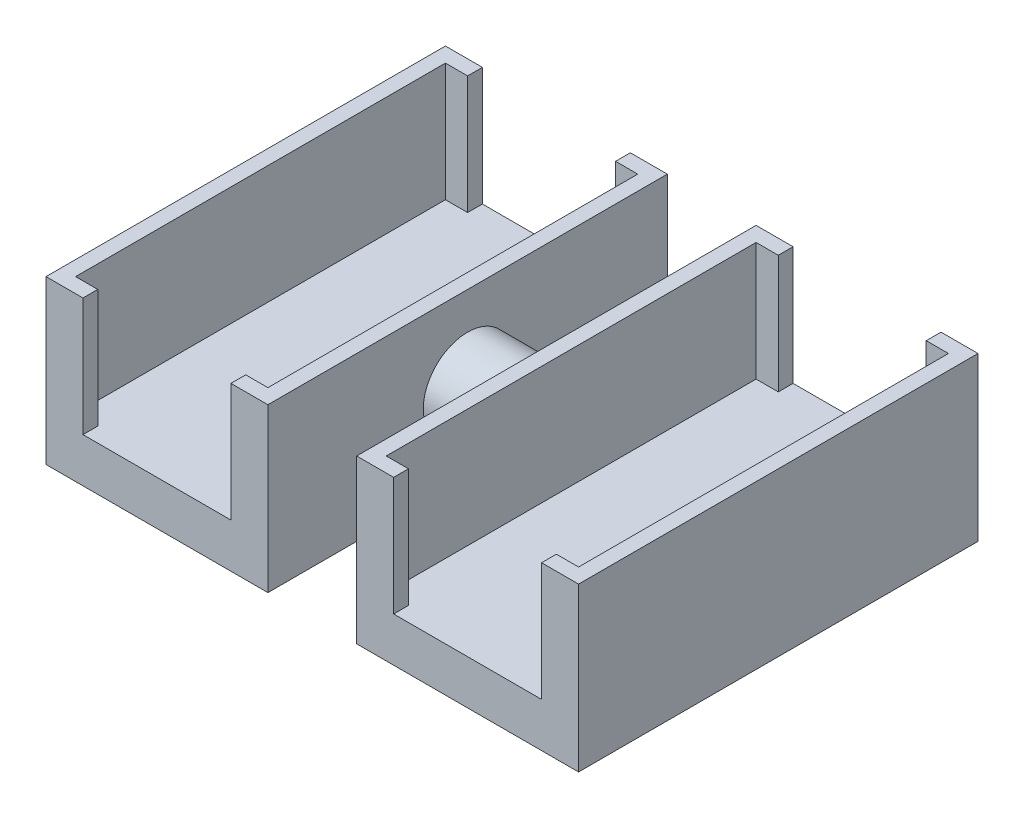
ISO-10303-21;
HEADER;
FILE_DESCRIPTION(('STEP AP214'),'2;1');
FILE_NAME('part.step','',(''),(''),'','','');
FILE_SCHEMA(('AUTOMOTIVE_DESIGN { 1 0 10303 214 1 1 1 1 }'));
ENDSEC;
DATA;
#1=APPLICATION_CONTEXT('core data for automotive mechanical design processes');
#2=APPLICATION_PROTOCOL_DEFINITION('international standard','automotive_design',2000,#1);
#3=PRODUCT_CONTEXT('',#1,'mechanical');
#4=PRODUCT('Part','Part','',(#3));
#5=PRODUCT_RELATED_PRODUCT_CATEGORY('part','',(#4));
#6=PRODUCT_DEFINITION_FORMATION('','',#4);
#7=PRODUCT_DEFINITION_CONTEXT('part definition',#1,'design');
#8=PRODUCT_DEFINITION('design','',#6,#7);
#9=PRODUCT_DEFINITION_SHAPE('','',#8);
#10=(LENGTH_UNIT() NAMED_UNIT(*) SI_UNIT(.MILLI.,.METRE.));
#11=(NAMED_UNIT(*) PLANE_ANGLE_UNIT() SI_UNIT($,.RADIAN.));
#12=(NAMED_UNIT(*) SI_UNIT($,.STERADIAN.) SOLID_ANGLE_UNIT());
#13=UNCERTAINTY_MEASURE_WITH_UNIT(LENGTH_MEASURE(1.E-05),#10,'distance_accuracy_value','');
#14=(GEOMETRIC_REPRESENTATION_CONTEXT(3) GLOBAL_UNCERTAINTY_ASSIGNED_CONTEXT((#13)) GLOBAL_UNIT_ASSIGNED_CONTEXT((#10,
#11,#12)) REPRESENTATION_CONTEXT('',''));
#15=CARTESIAN_POINT('',(0.,0.,0.));
#16=DIRECTION('',(0.,0.,1.));
#17=DIRECTION('',(1.,0.,0.));
#18=AXIS2_PLACEMENT_3D('',#15,#16,#17);
#19=CARTESIAN_POINT('',(0.,3.,0.));
#20=DIRECTION('',(0.,1.,0.));
#21=DIRECTION('',(0.,0.,1.));
#22=AXIS2_PLACEMENT_3D('',#19,#20,#21);
#23=PLANE('',#22);
#24=DIRECTION('',(1.,0.,0.));
#25=VECTOR('',#24,1.);
#26=CARTESIAN_POINT('',(0.,3.,-13.5));
#27=LINE('',#26,#25);
#28=CARTESIAN_POINT('',(-15.5,3.,-13.5));
#29=VERTEX_POINT('',#28);
#30=CARTESIAN_POINT('',(-5.50000000000001,3.,-13.5));
#31=VERTEX_POINT('',#30);
#32=EDGE_CURVE('E493',#29,#31,#27,.T.);
#33=ORIENTED_EDGE('',*,*,#32,.F.);
#34=DIRECTION('',(0.,0.,-1.));
#35=VECTOR('',#34,1.);
#36=CARTESIAN_POINT('',(-15.5,3.,0.));
#37=LINE('',#36,#35);
#38=CARTESIAN_POINT('',(-15.5,3.,-12.5));
#39=VERTEX_POINT('',#38);
#40=EDGE_CURVE('E416',#39,#29,#37,.T.);
#41=ORIENTED_EDGE('',*,*,#40,.F.);
#42=DIRECTION('',(1.,0.,0.));
#43=VECTOR('',#42,1.);
#44=CARTESIAN_POINT('',(0.,3.,-12.5));
#45=LINE('',#44,#43);
#46=CARTESIAN_POINT('',(-17.,3.,-12.5));
#47=VERTEX_POINT('',#46);
#48=EDGE_CURVE('E408',#47,#39,#45,.T.);
#49=ORIENTED_EDGE('',*,*,#48,.F.);
#50=DIRECTION('',(0.,0.,-1.));
#51=VECTOR('',#50,1.);
#52=CARTESIAN_POINT('',(-17.,3.,0.));
#53=LINE('',#52,#51);
#54=CARTESIAN_POINT('',(-17.,3.,12.5));
#55=VERTEX_POINT('',#54);
#56=EDGE_CURVE('E68',#55,#47,#53,.T.);
#57=ORIENTED_EDGE('',*,*,#56,.F.);
#58=DIRECTION('',(-1.,0.,0.));
#59=VECTOR('',#58,1.);
#60=CARTESIAN_POINT('',(0.,3.,12.5));
#61=LINE('',#60,#59);
#62=CARTESIAN_POINT('',(-15.5,3.,12.5));
#63=VERTEX_POINT('',#62);
#64=EDGE_CURVE('E63',#63,#55,#61,.T.);
#65=ORIENTED_EDGE('',*,*,#64,.F.);
#66=DIRECTION('',(0.,0.,-1.));
#67=VECTOR('',#66,1.);
#68=CARTESIAN_POINT('',(-15.5,3.,0.));
#69=LINE('',#68,#67);
#70=CARTESIAN_POINT('',(-15.5,3.,13.5));
#71=VERTEX_POINT('',#70);
#72=EDGE_CURVE('E414',#71,#63,#69,.T.);
#73=ORIENTED_EDGE('',*,*,#72,.F.);
#74=DIRECTION('',(-1.,0.,0.));
#75=VECTOR('',#74,1.);
#76=CARTESIAN_POINT('',(0.,3.,13.5));
#77=LINE('',#76,#75);
#78=CARTESIAN_POINT('',(-5.50000000000001,3.,13.5));
#79=VERTEX_POINT('',#78);
#80=EDGE_CURVE('E490',#79,#71,#77,.T.);
#81=ORIENTED_EDGE('',*,*,#80,.F.);
#82=DIRECTION('',(0.,0.,-1.));
#83=VECTOR('',#82,1.);
#84=CARTESIAN_POINT('',(-5.50000000000001,3.,0.));
#85=LINE('',#84,#83);
#86=CARTESIAN_POINT('',(-5.50000000000001,3.,12.5));
#87=VERTEX_POINT('',#86);
#88=EDGE_CURVE('E465',#79,#87,#85,.T.);
#89=ORIENTED_EDGE('',*,*,#88,.T.);
#90=DIRECTION('',(1.,0.,0.));
#91=VECTOR('',#90,1.);
#92=CARTESIAN_POINT('',(0.,3.,12.5));
#93=LINE('',#92,#91);
#94=CARTESIAN_POINT('',(-4.00000000000001,3.,12.5));
#95=VERTEX_POINT('',#94);
#96=EDGE_CURVE('E468',#87,#95,#93,.T.);
#97=ORIENTED_EDGE('',*,*,#96,.T.);
#98=DIRECTION('',(0.,0.,-1.));
#99=VECTOR('',#98,1.);
#100=CARTESIAN_POINT('',(-4.00000000000001,3.,0.));
#101=LINE('',#100,#99);
#102=CARTESIAN_POINT('',(-4.00000000000001,3.,-12.5));
#103=VERTEX_POINT('',#102);
#104=EDGE_CURVE('E471',#95,#103,#101,.T.);
#105=ORIENTED_EDGE('',*,*,#104,.T.);
#106=DIRECTION('',(-1.,0.,0.));
#107=VECTOR('',#106,1.);
#108=CARTESIAN_POINT('',(0.,3.,-12.5));
#109=LINE('',#108,#107);
#110=CARTESIAN_POINT('',(-5.50000000000001,3.,-12.5));
#111=VERTEX_POINT('',#110);
#112=EDGE_CURVE('E441',#103,#111,#109,.T.);
#113=ORIENTED_EDGE('',*,*,#112,.T.);
#114=DIRECTION('',(0.,0.,-1.));
#115=VECTOR('',#114,1.);
#116=CARTESIAN_POINT('',(-5.50000000000001,3.,0.));
#117=LINE('',#116,#115);
#118=EDGE_CURVE('E419',#111,#31,#117,.T.);
#119=ORIENTED_EDGE('',*,*,#118,.T.);
#120=EDGE_LOOP('',(#33,#41,#49,#57,#65,#73,#81,#89,#97,#105,#113,#119));
#121=FACE_BOUND('',#120,.T.);
#122=ADVANCED_FACE('F46',(#121),#23,.T.);
#123=CARTESIAN_POINT('',(0.,3.,13.5));
#124=DIRECTION('',(0.,0.,1.));
#125=DIRECTION('',(1.,0.,0.));
#126=AXIS2_PLACEMENT_3D('',#123,#124,#125);
#127=PLANE('',#126);
#128=DIRECTION('',(-1.,0.,0.));
#129=VECTOR('',#128,1.);
#130=CARTESIAN_POINT('',(0.,0.,13.5));
#131=LINE('',#130,#129);
#132=CARTESIAN_POINT('',(-3.00000000000001,0.,13.5));
#133=VERTEX_POINT('',#132);
#134=CARTESIAN_POINT('',(-18.,0.,13.5));
#135=VERTEX_POINT('',#134);
#136=EDGE_CURVE('E479',#133,#135,#131,.T.);
#137=ORIENTED_EDGE('',*,*,#136,.F.);
#138=DIRECTION('',(0.,-1.,0.));
#139=VECTOR('',#138,1.);
#140=CARTESIAN_POINT('',(-3.00000000000001,3.,13.5));
#141=LINE('',#140,#139);
#142=CARTESIAN_POINT('',(-3.00000000000001,11.,13.5));
#143=VERTEX_POINT('',#142);
#144=EDGE_CURVE('E50',#143,#133,#141,.T.);
#145=ORIENTED_EDGE('',*,*,#144,.F.);
#146=DIRECTION('',(-1.,0.,0.));
#147=VECTOR('',#146,1.);
#148=CARTESIAN_POINT('',(0.,11.,13.5));
#149=LINE('',#148,#147);
#150=CARTESIAN_POINT('',(-5.50000000000001,11.,13.5));
#151=VERTEX_POINT('',#150);
#152=EDGE_CURVE('E447',#143,#151,#149,.T.);
#153=ORIENTED_EDGE('',*,*,#152,.T.);
#154=DIRECTION('',(0.,-1.,0.));
#155=VECTOR('',#154,1.);
#156=CARTESIAN_POINT('',(-5.50000000000001,11.,13.5));
#157=LINE('',#156,#155);
#158=EDGE_CURVE('E486',#151,#79,#157,.T.);
#159=ORIENTED_EDGE('',*,*,#158,.T.);
#160=ORIENTED_EDGE('',*,*,#80,.T.);
#161=DIRECTION('',(0.,-1.,0.));
#162=VECTOR('',#161,1.);
#163=CARTESIAN_POINT('',(-15.5,11.,13.5));
#164=LINE('',#163,#162);
#165=CARTESIAN_POINT('',(-15.5,11.,13.5));
#166=VERTEX_POINT('',#165);
#167=EDGE_CURVE('E392',#166,#71,#164,.T.);
#168=ORIENTED_EDGE('',*,*,#167,.F.);
#169=DIRECTION('',(1.,0.,0.));
#170=VECTOR('',#169,1.);
#171=CARTESIAN_POINT('',(0.,11.,13.5));
#172=LINE('',#171,#170);
#173=CARTESIAN_POINT('',(-18.,11.,13.5));
#174=VERTEX_POINT('',#173);
#175=EDGE_CURVE('E427',#174,#166,#172,.T.);
#176=ORIENTED_EDGE('',*,*,#175,.F.);
#177=DIRECTION('',(0.,-1.,0.));
#178=VECTOR('',#177,1.);
#179=CARTESIAN_POINT('',(-18.,3.,13.5));
#180=LINE('',#179,#178);
#181=EDGE_CURVE('E496',#174,#135,#180,.T.);
#182=ORIENTED_EDGE('',*,*,#181,.T.);
#183=EDGE_LOOP('',(#137,#145,#153,#159,#160,#168,#176,#182));
#184=FACE_BOUND('',#183,.T.);
#185=ADVANCED_FACE('F48',(#184),#127,.T.);
#186=CARTESIAN_POINT('',(-3.00000000000001,3.,0.));
#187=DIRECTION('',(1.,0.,0.));
#188=DIRECTION('',(0.,0.,-1.));
#189=AXIS2_PLACEMENT_3D('',#186,#187,#188);
#190=PLANE('',#189);
#191=CARTESIAN_POINT('',(-3.00000000000001,5.5,0.));
#192=DIRECTION('',(1.,0.,0.));
#193=DIRECTION('',(0.,0.,-1.));
#194=AXIS2_PLACEMENT_3D('',#191,#192,#193);
#195=CIRCLE('',#194,3.);
#196=CARTESIAN_POINT('',(-3.00000000000001,5.5,-3.));
#197=VERTEX_POINT('',#196);
#198=EDGE_CURVE('E384',#197,#197,#195,.F.);
#199=ORIENTED_EDGE('',*,*,#198,.T.);
#200=EDGE_LOOP('',(#199));
#201=FACE_BOUND('',#200,.T.);
#202=DIRECTION('',(0.,0.,1.));
#203=VECTOR('',#202,1.);
#204=CARTESIAN_POINT('',(-3.00000000000001,0.,0.));
#205=LINE('',#204,#203);
#206=CARTESIAN_POINT('',(-3.00000000000001,0.,-13.5));
#207=VERTEX_POINT('',#206);
#208=EDGE_CURVE('E499',#207,#133,#205,.T.);
#209=ORIENTED_EDGE('',*,*,#208,.F.);
#210=DIRECTION('',(0.,-1.,0.));
#211=VECTOR('',#210,1.);
#212=CARTESIAN_POINT('',(-3.00000000000001,3.,-13.5));
#213=LINE('',#212,#211);
#214=CARTESIAN_POINT('',(-3.00000000000001,11.,-13.5));
#215=VERTEX_POINT('',#214);
#216=EDGE_CURVE('E509',#215,#207,#213,.T.);
#217=ORIENTED_EDGE('',*,*,#216,.F.);
#218=DIRECTION('',(0.,0.,-1.));
#219=VECTOR('',#218,1.);
#220=CARTESIAN_POINT('',(-3.00000000000001,11.,0.));
#221=LINE('',#220,#219);
#222=EDGE_CURVE('E444',#143,#215,#221,.T.);
#223=ORIENTED_EDGE('',*,*,#222,.F.);
#224=ORIENTED_EDGE('',*,*,#144,.T.);
#225=EDGE_LOOP('',(#209,#217,#223,#224));
#226=FACE_BOUND('',#225,.T.);
#227=ADVANCED_FACE('F516',(#201,#226),#190,.T.);
#228=CARTESIAN_POINT('',(0.,3.,-13.5));
#229=DIRECTION('',(0.,0.,-1.));
#230=DIRECTION('',(-1.,0.,0.));
#231=AXIS2_PLACEMENT_3D('',#228,#229,#230);
#232=PLANE('',#231);
#233=DIRECTION('',(1.,0.,0.));
#234=VECTOR('',#233,1.);
#235=CARTESIAN_POINT('',(0.,0.,-13.5));
#236=LINE('',#235,#234);
#237=CARTESIAN_POINT('',(-18.,0.,-13.5));
#238=VERTEX_POINT('',#237);
#239=EDGE_CURVE('E502',#238,#207,#236,.T.);
#240=ORIENTED_EDGE('',*,*,#239,.F.);
#241=DIRECTION('',(0.,-1.,0.));
#242=VECTOR('',#241,1.);
#243=CARTESIAN_POINT('',(-18.,3.,-13.5));
#244=LINE('',#243,#242);
#245=CARTESIAN_POINT('',(-18.,11.,-13.5));
#246=VERTEX_POINT('',#245);
#247=EDGE_CURVE('E508',#246,#238,#244,.T.);
#248=ORIENTED_EDGE('',*,*,#247,.F.);
#249=DIRECTION('',(-1.,0.,0.));
#250=VECTOR('',#249,1.);
#251=CARTESIAN_POINT('',(0.,11.,-13.5));
#252=LINE('',#251,#250);
#253=CARTESIAN_POINT('',(-15.5,11.,-13.5));
#254=VERTEX_POINT('',#253);
#255=EDGE_CURVE('E432',#254,#246,#252,.T.);
#256=ORIENTED_EDGE('',*,*,#255,.F.);
#257=DIRECTION('',(0.,-1.,0.));
#258=VECTOR('',#257,1.);
#259=CARTESIAN_POINT('',(-15.5,11.,-13.5));
#260=LINE('',#259,#258);
#261=EDGE_CURVE('E388',#254,#29,#260,.T.);
#262=ORIENTED_EDGE('',*,*,#261,.T.);
#263=ORIENTED_EDGE('',*,*,#32,.T.);
#264=DIRECTION('',(0.,-1.,0.));
#265=VECTOR('',#264,1.);
#266=CARTESIAN_POINT('',(-5.50000000000001,11.,-13.5));
#267=LINE('',#266,#265);
#268=CARTESIAN_POINT('',(-5.50000000000001,11.,-13.5));
#269=VERTEX_POINT('',#268);
#270=EDGE_CURVE('E462',#269,#31,#267,.T.);
#271=ORIENTED_EDGE('',*,*,#270,.F.);
#272=DIRECTION('',(1.,0.,0.));
#273=VECTOR('',#272,1.);
#274=CARTESIAN_POINT('',(0.,11.,-13.5));
#275=LINE('',#274,#273);
#276=EDGE_CURVE('E440',#269,#215,#275,.T.);
#277=ORIENTED_EDGE('',*,*,#276,.T.);
#278=ORIENTED_EDGE('',*,*,#216,.T.);
#279=EDGE_LOOP('',(#240,#248,#256,#262,#263,#271,#277,#278));
#280=FACE_BOUND('',#279,.T.);
#281=ADVANCED_FACE('F523',(#280),#232,.T.);
#282=CARTESIAN_POINT('',(-18.,3.,0.));
#283=DIRECTION('',(1.,0.,0.));
#284=DIRECTION('',(0.,0.,-1.));
#285=AXIS2_PLACEMENT_3D('',#282,#283,#284);
#286=PLANE('',#285);
#287=DIRECTION('',(0.,0.,1.));
#288=VECTOR('',#287,1.);
#289=CARTESIAN_POINT('',(-18.,0.,0.));
#290=LINE('',#289,#288);
#291=EDGE_CURVE('E494',#238,#135,#290,.T.);
#292=ORIENTED_EDGE('',*,*,#291,.T.);
#293=ORIENTED_EDGE('',*,*,#181,.F.);
#294=DIRECTION('',(0.,0.,-1.));
#295=VECTOR('',#294,1.);
#296=CARTESIAN_POINT('',(-18.,11.,0.));
#297=LINE('',#296,#295);
#298=EDGE_CURVE('E429',#174,#246,#297,.T.);
#299=ORIENTED_EDGE('',*,*,#298,.T.);
#300=ORIENTED_EDGE('',*,*,#247,.T.);
#301=EDGE_LOOP('',(#292,#293,#299,#300));
#302=FACE_BOUND('',#301,.T.);
#303=ADVANCED_FACE('F530',(#302),#286,.F.);
#304=CARTESIAN_POINT('',(0.,0.,0.));
#305=DIRECTION('',(0.,1.,0.));
#306=DIRECTION('',(0.,0.,1.));
#307=AXIS2_PLACEMENT_3D('',#304,#305,#306);
#308=PLANE('',#307);
#309=ORIENTED_EDGE('',*,*,#136,.T.);
#310=ORIENTED_EDGE('',*,*,#291,.F.);
#311=ORIENTED_EDGE('',*,*,#239,.T.);
#312=ORIENTED_EDGE('',*,*,#208,.T.);
#313=EDGE_LOOP('',(#309,#310,#311,#312));
#314=FACE_BOUND('',#313,.T.);
#315=ADVANCED_FACE('F522',(#314),#308,.F.);
#316=CARTESIAN_POINT('',(-5.50000000000001,11.,0.));
#317=DIRECTION('',(-1.,0.,0.));
#318=DIRECTION('',(0.,0.,1.));
#319=AXIS2_PLACEMENT_3D('',#316,#317,#318);
#320=PLANE('',#319);
#321=ORIENTED_EDGE('',*,*,#118,.F.);
#322=DIRECTION('',(0.,-1.,0.));
#323=VECTOR('',#322,1.);
#324=CARTESIAN_POINT('',(-5.50000000000001,11.,-12.5));
#325=LINE('',#324,#323);
#326=CARTESIAN_POINT('',(-5.50000000000001,11.,-12.5));
#327=VERTEX_POINT('',#326);
#328=EDGE_CURVE('E476',#327,#111,#325,.T.);
#329=ORIENTED_EDGE('',*,*,#328,.F.);
#330=DIRECTION('',(0.,0.,-1.));
#331=VECTOR('',#330,1.);
#332=CARTESIAN_POINT('',(-5.50000000000001,11.,0.));
#333=LINE('',#332,#331);
#334=EDGE_CURVE('E437',#327,#269,#333,.T.);
#335=ORIENTED_EDGE('',*,*,#334,.T.);
#336=ORIENTED_EDGE('',*,*,#270,.T.);
#337=EDGE_LOOP('',(#321,#329,#335,#336));
#338=FACE_BOUND('',#337,.T.);
#339=ADVANCED_FACE('F552',(#338),#320,.T.);
#340=CARTESIAN_POINT('',(0.,11.,-12.5));
#341=DIRECTION('',(0.,0.,1.));
#342=DIRECTION('',(1.,0.,0.));
#343=AXIS2_PLACEMENT_3D('',#340,#341,#342);
#344=PLANE('',#343);
#345=ORIENTED_EDGE('',*,*,#112,.F.);
#346=DIRECTION('',(0.,-1.,0.));
#347=VECTOR('',#346,1.);
#348=CARTESIAN_POINT('',(-4.00000000000001,11.,-12.5));
#349=LINE('',#348,#347);
#350=CARTESIAN_POINT('',(-4.00000000000001,11.,-12.5));
#351=VERTEX_POINT('',#350);
#352=EDGE_CURVE('E480',#351,#103,#349,.T.);
#353=ORIENTED_EDGE('',*,*,#352,.F.);
#354=DIRECTION('',(-1.,0.,0.));
#355=VECTOR('',#354,1.);
#356=CARTESIAN_POINT('',(0.,11.,-12.5));
#357=LINE('',#356,#355);
#358=EDGE_CURVE('E459',#351,#327,#357,.T.);
#359=ORIENTED_EDGE('',*,*,#358,.T.);
#360=ORIENTED_EDGE('',*,*,#328,.T.);
#361=EDGE_LOOP('',(#345,#353,#359,#360));
#362=FACE_BOUND('',#361,.T.);
#363=ADVANCED_FACE('F557',(#362),#344,.T.);
#364=CARTESIAN_POINT('',(-4.00000000000001,11.,0.));
#365=DIRECTION('',(-1.,0.,0.));
#366=DIRECTION('',(0.,0.,1.));
#367=AXIS2_PLACEMENT_3D('',#364,#365,#366);
#368=PLANE('',#367);
#369=ORIENTED_EDGE('',*,*,#104,.F.);
#370=DIRECTION('',(0.,-1.,0.));
#371=VECTOR('',#370,1.);
#372=CARTESIAN_POINT('',(-4.00000000000001,11.,12.5));
#373=LINE('',#372,#371);
#374=CARTESIAN_POINT('',(-4.00000000000001,11.,12.5));
#375=VERTEX_POINT('',#374);
#376=EDGE_CURVE('E482',#375,#95,#373,.T.);
#377=ORIENTED_EDGE('',*,*,#376,.F.);
#378=DIRECTION('',(0.,0.,-1.));
#379=VECTOR('',#378,1.);
#380=CARTESIAN_POINT('',(-4.00000000000001,11.,0.));
#381=LINE('',#380,#379);
#382=EDGE_CURVE('E456',#375,#351,#381,.T.);
#383=ORIENTED_EDGE('',*,*,#382,.T.);
#384=ORIENTED_EDGE('',*,*,#352,.T.);
#385=EDGE_LOOP('',(#369,#377,#383,#384));
#386=FACE_BOUND('',#385,.T.);
#387=ADVANCED_FACE('F572',(#386),#368,.T.);
#388=CARTESIAN_POINT('',(0.,11.,12.5));
#389=DIRECTION('',(0.,0.,-1.));
#390=DIRECTION('',(-1.,0.,0.));
#391=AXIS2_PLACEMENT_3D('',#388,#389,#390);
#392=PLANE('',#391);
#393=ORIENTED_EDGE('',*,*,#96,.F.);
#394=DIRECTION('',(0.,-1.,0.));
#395=VECTOR('',#394,1.);
#396=CARTESIAN_POINT('',(-5.50000000000001,11.,12.5));
#397=LINE('',#396,#395);
#398=CARTESIAN_POINT('',(-5.50000000000001,11.,12.5));
#399=VERTEX_POINT('',#398);
#400=EDGE_CURVE('E484',#399,#87,#397,.T.);
#401=ORIENTED_EDGE('',*,*,#400,.F.);
#402=DIRECTION('',(1.,0.,0.));
#403=VECTOR('',#402,1.);
#404=CARTESIAN_POINT('',(0.,11.,12.5));
#405=LINE('',#404,#403);
#406=EDGE_CURVE('E453',#399,#375,#405,.T.);
#407=ORIENTED_EDGE('',*,*,#406,.T.);
#408=ORIENTED_EDGE('',*,*,#376,.T.);
#409=EDGE_LOOP('',(#393,#401,#407,#408));
#410=FACE_BOUND('',#409,.T.);
#411=ADVANCED_FACE('F570',(#410),#392,.T.);
#412=CARTESIAN_POINT('',(-5.50000000000001,11.,0.));
#413=DIRECTION('',(-1.,0.,0.));
#414=DIRECTION('',(0.,0.,1.));
#415=AXIS2_PLACEMENT_3D('',#412,#413,#414);
#416=PLANE('',#415);
#417=ORIENTED_EDGE('',*,*,#88,.F.);
#418=ORIENTED_EDGE('',*,*,#158,.F.);
#419=DIRECTION('',(0.,0.,-1.));
#420=VECTOR('',#419,1.);
#421=CARTESIAN_POINT('',(-5.50000000000001,11.,0.));
#422=LINE('',#421,#420);
#423=EDGE_CURVE('E450',#151,#399,#422,.T.);
#424=ORIENTED_EDGE('',*,*,#423,.T.);
#425=ORIENTED_EDGE('',*,*,#400,.T.);
#426=EDGE_LOOP('',(#417,#418,#424,#425));
#427=FACE_BOUND('',#426,.T.);
#428=ADVANCED_FACE('F567',(#427),#416,.T.);
#429=CARTESIAN_POINT('',(0.,11.,0.));
#430=DIRECTION('',(0.,-1.,0.));
#431=DIRECTION('',(0.,0.,-1.));
#432=AXIS2_PLACEMENT_3D('',#429,#430,#431);
#433=PLANE('',#432);
#434=ORIENTED_EDGE('',*,*,#334,.F.);
#435=ORIENTED_EDGE('',*,*,#358,.F.);
#436=ORIENTED_EDGE('',*,*,#382,.F.);
#437=ORIENTED_EDGE('',*,*,#406,.F.);
#438=ORIENTED_EDGE('',*,*,#423,.F.);
#439=ORIENTED_EDGE('',*,*,#152,.F.);
#440=ORIENTED_EDGE('',*,*,#222,.T.);
#441=ORIENTED_EDGE('',*,*,#276,.F.);
#442=EDGE_LOOP('',(#434,#435,#436,#437,#438,#439,#440,#441));
#443=FACE_BOUND('',#442,.T.);
#444=ADVANCED_FACE('F560',(#443),#433,.F.);
#445=CARTESIAN_POINT('',(-15.5,11.,0.));
#446=DIRECTION('',(-1.,0.,0.));
#447=DIRECTION('',(0.,0.,1.));
#448=AXIS2_PLACEMENT_3D('',#445,#446,#447);
#449=PLANE('',#448);
#450=ORIENTED_EDGE('',*,*,#40,.T.);
#451=ORIENTED_EDGE('',*,*,#261,.F.);
#452=DIRECTION('',(0.,0.,-1.));
#453=VECTOR('',#452,1.);
#454=CARTESIAN_POINT('',(-15.5,11.,0.));
#455=LINE('',#454,#453);
#456=CARTESIAN_POINT('',(-15.5,11.,-12.5));
#457=VERTEX_POINT('',#456);
#458=EDGE_CURVE('E411',#457,#254,#455,.T.);
#459=ORIENTED_EDGE('',*,*,#458,.F.);
#460=DIRECTION('',(0.,-1.,0.));
#461=VECTOR('',#460,1.);
#462=CARTESIAN_POINT('',(-15.5,11.,-12.5));
#463=LINE('',#462,#461);
#464=EDGE_CURVE('E404',#457,#39,#463,.T.);
#465=ORIENTED_EDGE('',*,*,#464,.T.);
#466=EDGE_LOOP('',(#450,#451,#459,#465));
#467=FACE_BOUND('',#466,.T.);
#468=ADVANCED_FACE('F549',(#467),#449,.F.);
#469=CARTESIAN_POINT('',(-15.5,11.,0.));
#470=DIRECTION('',(-1.,0.,0.));
#471=DIRECTION('',(0.,0.,1.));
#472=AXIS2_PLACEMENT_3D('',#469,#470,#471);
#473=PLANE('',#472);
#474=ORIENTED_EDGE('',*,*,#72,.T.);
#475=DIRECTION('',(0.,-1.,0.));
#476=VECTOR('',#475,1.);
#477=CARTESIAN_POINT('',(-15.5,11.,12.5));
#478=LINE('',#477,#476);
#479=CARTESIAN_POINT('',(-15.5,11.,12.5));
#480=VERTEX_POINT('',#479);
#481=EDGE_CURVE('E395',#480,#63,#478,.T.);
#482=ORIENTED_EDGE('',*,*,#481,.F.);
#483=DIRECTION('',(0.,0.,-1.));
#484=VECTOR('',#483,1.);
#485=CARTESIAN_POINT('',(-15.5,11.,0.));
#486=LINE('',#485,#484);
#487=EDGE_CURVE('E425',#166,#480,#486,.T.);
#488=ORIENTED_EDGE('',*,*,#487,.F.);
#489=ORIENTED_EDGE('',*,*,#167,.T.);
#490=EDGE_LOOP('',(#474,#482,#488,#489));
#491=FACE_BOUND('',#490,.T.);
#492=ADVANCED_FACE('F537',(#491),#473,.F.);
#493=CARTESIAN_POINT('',(0.,11.,12.5));
#494=DIRECTION('',(0.,0.,1.));
#495=DIRECTION('',(1.,0.,0.));
#496=AXIS2_PLACEMENT_3D('',#493,#494,#495);
#497=PLANE('',#496);
#498=ORIENTED_EDGE('',*,*,#64,.T.);
#499=DIRECTION('',(0.,-1.,0.));
#500=VECTOR('',#499,1.);
#501=CARTESIAN_POINT('',(-17.,11.,12.5));
#502=LINE('',#501,#500);
#503=CARTESIAN_POINT('',(-17.,11.,12.5));
#504=VERTEX_POINT('',#503);
#505=EDGE_CURVE('E398',#504,#55,#502,.T.);
#506=ORIENTED_EDGE('',*,*,#505,.F.);
#507=DIRECTION('',(-1.,0.,0.));
#508=VECTOR('',#507,1.);
#509=CARTESIAN_POINT('',(0.,11.,12.5));
#510=LINE('',#509,#508);
#511=EDGE_CURVE('E423',#480,#504,#510,.T.);
#512=ORIENTED_EDGE('',*,*,#511,.F.);
#513=ORIENTED_EDGE('',*,*,#481,.T.);
#514=EDGE_LOOP('',(#498,#506,#512,#513));
#515=FACE_BOUND('',#514,.T.);
#516=ADVANCED_FACE('F539',(#515),#497,.F.);
#517=CARTESIAN_POINT('',(-17.,11.,0.));
#518=DIRECTION('',(-1.,0.,0.));
#519=DIRECTION('',(0.,0.,1.));
#520=AXIS2_PLACEMENT_3D('',#517,#518,#519);
#521=PLANE('',#520);
#522=ORIENTED_EDGE('',*,*,#56,.T.);
#523=DIRECTION('',(0.,-1.,0.));
#524=VECTOR('',#523,1.);
#525=CARTESIAN_POINT('',(-17.,11.,-12.5));
#526=LINE('',#525,#524);
#527=CARTESIAN_POINT('',(-17.,11.,-12.5));
#528=VERTEX_POINT('',#527);
#529=EDGE_CURVE('E401',#528,#47,#526,.T.);
#530=ORIENTED_EDGE('',*,*,#529,.F.);
#531=DIRECTION('',(0.,0.,-1.));
#532=VECTOR('',#531,1.);
#533=CARTESIAN_POINT('',(-17.,11.,0.));
#534=LINE('',#533,#532);
#535=EDGE_CURVE('E421',#504,#528,#534,.T.);
#536=ORIENTED_EDGE('',*,*,#535,.F.);
#537=ORIENTED_EDGE('',*,*,#505,.T.);
#538=EDGE_LOOP('',(#522,#530,#536,#537));
#539=FACE_BOUND('',#538,.T.);
#540=ADVANCED_FACE('F543',(#539),#521,.F.);
#541=CARTESIAN_POINT('',(0.,11.,-12.5));
#542=DIRECTION('',(0.,0.,-1.));
#543=DIRECTION('',(-1.,0.,0.));
#544=AXIS2_PLACEMENT_3D('',#541,#542,#543);
#545=PLANE('',#544);
#546=ORIENTED_EDGE('',*,*,#48,.T.);
#547=ORIENTED_EDGE('',*,*,#464,.F.);
#548=DIRECTION('',(1.,0.,0.));
#549=VECTOR('',#548,1.);
#550=CARTESIAN_POINT('',(0.,11.,-12.5));
#551=LINE('',#550,#549);
#552=EDGE_CURVE('E407',#528,#457,#551,.T.);
#553=ORIENTED_EDGE('',*,*,#552,.F.);
#554=ORIENTED_EDGE('',*,*,#529,.T.);
#555=EDGE_LOOP('',(#546,#547,#553,#554));
#556=FACE_BOUND('',#555,.T.);
#557=ADVANCED_FACE('F547',(#556),#545,.F.);
#558=CARTESIAN_POINT('',(0.,11.,0.));
#559=DIRECTION('',(0.,1.,0.));
#560=DIRECTION('',(0.,0.,1.));
#561=AXIS2_PLACEMENT_3D('',#558,#559,#560);
#562=PLANE('',#561);
#563=ORIENTED_EDGE('',*,*,#458,.T.);
#564=ORIENTED_EDGE('',*,*,#255,.T.);
#565=ORIENTED_EDGE('',*,*,#298,.F.);
#566=ORIENTED_EDGE('',*,*,#175,.T.);
#567=ORIENTED_EDGE('',*,*,#487,.T.);
#568=ORIENTED_EDGE('',*,*,#511,.T.);
#569=ORIENTED_EDGE('',*,*,#535,.T.);
#570=ORIENTED_EDGE('',*,*,#552,.T.);
#571=EDGE_LOOP('',(#563,#564,#565,#566,#567,#568,#569,#570));
#572=FACE_BOUND('',#571,.T.);
#573=ADVANCED_FACE('F527',(#572),#562,.T.);
#574=CARTESIAN_POINT('',(-18.002,5.5,0.));
#575=DIRECTION('',(1.,0.,0.));
#576=DIRECTION('',(0.,0.,-1.));
#577=AXIS2_PLACEMENT_3D('',#574,#575,#576);
#578=CYLINDRICAL_SURFACE('',#577,3.);
#579=ORIENTED_EDGE('',*,*,#198,.F.);
#580=EDGE_LOOP('',(#579));
#581=FACE_BOUND('',#580,.T.);
#582=CARTESIAN_POINT('',(3.00000000000001,5.5,0.));
#583=DIRECTION('',(-1.,0.,0.));
#584=DIRECTION('',(0.,0.,1.));
#585=AXIS2_PLACEMENT_3D('',#582,#583,#584);
#586=CIRCLE('',#585,3.);
#587=CARTESIAN_POINT('',(3.00000000000001,5.5,3.));
#588=VERTEX_POINT('',#587);
#589=EDGE_CURVE('E380',#588,#588,#586,.T.);
#590=ORIENTED_EDGE('',*,*,#589,.T.);
#591=EDGE_LOOP('',(#590));
#592=FACE_BOUND('',#591,.T.);
#593=ADVANCED_FACE('F759',(#581,#592),#578,.T.);
#594=CARTESIAN_POINT('',(0.,11.,0.));
#595=DIRECTION('',(0.,1.,0.));
#596=DIRECTION('',(0.,0.,1.));
#597=AXIS2_PLACEMENT_3D('',#594,#595,#596);
#598=PLANE('',#597);
#599=DIRECTION('',(0.,0.,-1.));
#600=VECTOR('',#599,1.);
#601=CARTESIAN_POINT('',(15.5,11.,0.));
#602=LINE('',#601,#600);
#603=CARTESIAN_POINT('',(15.5,11.,-12.5));
#604=VERTEX_POINT('',#603);
#605=CARTESIAN_POINT('',(15.5,11.,-13.5));
#606=VERTEX_POINT('',#605);
#607=EDGE_CURVE('E267',#604,#606,#602,.T.);
#608=ORIENTED_EDGE('',*,*,#607,.F.);
#609=DIRECTION('',(-1.,0.,0.));
#610=VECTOR('',#609,1.);
#611=CARTESIAN_POINT('',(0.,11.,-12.5));
#612=LINE('',#611,#610);
#613=CARTESIAN_POINT('',(17.,11.,-12.5));
#614=VERTEX_POINT('',#613);
#615=EDGE_CURVE('E254',#614,#604,#612,.T.);
#616=ORIENTED_EDGE('',*,*,#615,.F.);
#617=DIRECTION('',(0.,0.,-1.));
#618=VECTOR('',#617,1.);
#619=CARTESIAN_POINT('',(17.,11.,0.));
#620=LINE('',#619,#618);
#621=CARTESIAN_POINT('',(17.,11.,12.5));
#622=VERTEX_POINT('',#621);
#623=EDGE_CURVE('E264',#622,#614,#620,.T.);
#624=ORIENTED_EDGE('',*,*,#623,.F.);
#625=DIRECTION('',(1.,0.,0.));
#626=VECTOR('',#625,1.);
#627=CARTESIAN_POINT('',(0.,11.,12.5));
#628=LINE('',#627,#626);
#629=CARTESIAN_POINT('',(15.5,11.,12.5));
#630=VERTEX_POINT('',#629);
#631=EDGE_CURVE('E297',#630,#622,#628,.T.);
#632=ORIENTED_EDGE('',*,*,#631,.F.);
#633=DIRECTION('',(0.,0.,-1.));
#634=VECTOR('',#633,1.);
#635=CARTESIAN_POINT('',(15.5,11.,0.));
#636=LINE('',#635,#634);
#637=CARTESIAN_POINT('',(15.5,11.,13.5));
#638=VERTEX_POINT('',#637);
#639=EDGE_CURVE('E300',#638,#630,#636,.T.);
#640=ORIENTED_EDGE('',*,*,#639,.F.);
#641=DIRECTION('',(-1.,0.,0.));
#642=VECTOR('',#641,1.);
#643=CARTESIAN_POINT('',(0.,11.,13.5));
#644=LINE('',#643,#642);
#645=CARTESIAN_POINT('',(18.,11.,13.5));
#646=VERTEX_POINT('',#645);
#647=EDGE_CURVE('E303',#646,#638,#644,.T.);
#648=ORIENTED_EDGE('',*,*,#647,.F.);
#649=DIRECTION('',(0.,0.,-1.));
#650=VECTOR('',#649,1.);
#651=CARTESIAN_POINT('',(18.,11.,0.));
#652=LINE('',#651,#650);
#653=CARTESIAN_POINT('',(18.,11.,-13.5));
#654=VERTEX_POINT('',#653);
#655=EDGE_CURVE('E306',#646,#654,#652,.T.);
#656=ORIENTED_EDGE('',*,*,#655,.T.);
#657=DIRECTION('',(1.,0.,0.));
#658=VECTOR('',#657,1.);
#659=CARTESIAN_POINT('',(0.,11.,-13.5));
#660=LINE('',#659,#658);
#661=EDGE_CURVE('E270',#606,#654,#660,.T.);
#662=ORIENTED_EDGE('',*,*,#661,.F.);
#663=EDGE_LOOP('',(#608,#616,#624,#632,#640,#648,#656,#662));
#664=FACE_BOUND('',#663,.T.);
#665=ADVANCED_FACE('F268',(#664),#598,.T.);
#666=CARTESIAN_POINT('',(0.,11.,-12.5));
#667=DIRECTION('',(0.,0.,-1.));
#668=DIRECTION('',(1.,0.,0.));
#669=AXIS2_PLACEMENT_3D('',#666,#667,#668);
#670=PLANE('',#669);
#671=DIRECTION('',(-1.,0.,0.));
#672=VECTOR('',#671,1.);
#673=CARTESIAN_POINT('',(0.,3.,-12.5));
#674=LINE('',#673,#672);
#675=CARTESIAN_POINT('',(17.,3.,-12.5));
#676=VERTEX_POINT('',#675);
#677=CARTESIAN_POINT('',(15.5,3.,-12.5));
#678=VERTEX_POINT('',#677);
#679=EDGE_CURVE('E273',#676,#678,#674,.T.);
#680=ORIENTED_EDGE('',*,*,#679,.F.);
#681=DIRECTION('',(0.,-1.,0.));
#682=VECTOR('',#681,1.);
#683=CARTESIAN_POINT('',(17.,11.,-12.5));
#684=LINE('',#683,#682);
#685=EDGE_CURVE('E261',#614,#676,#684,.T.);
#686=ORIENTED_EDGE('',*,*,#685,.F.);
#687=ORIENTED_EDGE('',*,*,#615,.T.);
#688=DIRECTION('',(0.,-1.,0.));
#689=VECTOR('',#688,1.);
#690=CARTESIAN_POINT('',(15.5,11.,-12.5));
#691=LINE('',#690,#689);
#692=EDGE_CURVE('E259',#604,#678,#691,.T.);
#693=ORIENTED_EDGE('',*,*,#692,.T.);
#694=EDGE_LOOP('',(#680,#686,#687,#693));
#695=FACE_BOUND('',#694,.T.);
#696=ADVANCED_FACE('F257',(#695),#670,.F.);
#697=CARTESIAN_POINT('',(17.,11.,0.));
#698=DIRECTION('',(1.,0.,0.));
#699=DIRECTION('',(0.,0.,1.));
#700=AXIS2_PLACEMENT_3D('',#697,#698,#699);
#701=PLANE('',#700);
#702=DIRECTION('',(0.,0.,-1.));
#703=VECTOR('',#702,1.);
#704=CARTESIAN_POINT('',(17.,3.,0.));
#705=LINE('',#704,#703);
#706=CARTESIAN_POINT('',(17.,3.,12.5));
#707=VERTEX_POINT('',#706);
#708=EDGE_CURVE('E285',#707,#676,#705,.T.);
#709=ORIENTED_EDGE('',*,*,#708,.F.);
#710=DIRECTION('',(0.,-1.,0.));
#711=VECTOR('',#710,1.);
#712=CARTESIAN_POINT('',(17.,11.,12.5));
#713=LINE('',#712,#711);
#714=EDGE_CURVE('E280',#622,#707,#713,.T.);
#715=ORIENTED_EDGE('',*,*,#714,.F.);
#716=ORIENTED_EDGE('',*,*,#623,.T.);
#717=ORIENTED_EDGE('',*,*,#685,.T.);
#718=EDGE_LOOP('',(#709,#715,#716,#717));
#719=FACE_BOUND('',#718,.T.);
#720=ADVANCED_FACE('F666',(#719),#701,.F.);
#721=CARTESIAN_POINT('',(0.,11.,12.5));
#722=DIRECTION('',(0.,0.,1.));
#723=DIRECTION('',(-1.,0.,0.));
#724=AXIS2_PLACEMENT_3D('',#721,#722,#723);
#725=PLANE('',#724);
#726=DIRECTION('',(1.,0.,0.));
#727=VECTOR('',#726,1.);
#728=CARTESIAN_POINT('',(0.,3.,12.5));
#729=LINE('',#728,#727);
#730=CARTESIAN_POINT('',(15.5,3.,12.5));
#731=VERTEX_POINT('',#730);
#732=EDGE_CURVE('E288',#731,#707,#729,.T.);
#733=ORIENTED_EDGE('',*,*,#732,.F.);
#734=DIRECTION('',(0.,-1.,0.));
#735=VECTOR('',#734,1.);
#736=CARTESIAN_POINT('',(15.5,11.,12.5));
#737=LINE('',#736,#735);
#738=EDGE_CURVE('E655',#630,#731,#737,.T.);
#739=ORIENTED_EDGE('',*,*,#738,.F.);
#740=ORIENTED_EDGE('',*,*,#631,.T.);
#741=ORIENTED_EDGE('',*,*,#714,.T.);
#742=EDGE_LOOP('',(#733,#739,#740,#741));
#743=FACE_BOUND('',#742,.T.);
#744=ADVANCED_FACE('F664',(#743),#725,.F.);
#745=CARTESIAN_POINT('',(15.5,11.,0.));
#746=DIRECTION('',(1.,0.,0.));
#747=DIRECTION('',(0.,0.,1.));
#748=AXIS2_PLACEMENT_3D('',#745,#746,#747);
#749=PLANE('',#748);
#750=DIRECTION('',(0.,0.,-1.));
#751=VECTOR('',#750,1.);
#752=CARTESIAN_POINT('',(15.5,3.,0.));
#753=LINE('',#752,#751);
#754=CARTESIAN_POINT('',(15.5,3.,13.5));
#755=VERTEX_POINT('',#754);
#756=EDGE_CURVE('E291',#755,#731,#753,.T.);
#757=ORIENTED_EDGE('',*,*,#756,.F.);
#758=DIRECTION('',(0.,-1.,0.));
#759=VECTOR('',#758,1.);
#760=CARTESIAN_POINT('',(15.5,11.,13.5));
#761=LINE('',#760,#759);
#762=EDGE_CURVE('E650',#638,#755,#761,.T.);
#763=ORIENTED_EDGE('',*,*,#762,.F.);
#764=ORIENTED_EDGE('',*,*,#639,.T.);
#765=ORIENTED_EDGE('',*,*,#738,.T.);
#766=EDGE_LOOP('',(#757,#763,#764,#765));
#767=FACE_BOUND('',#766,.T.);
#768=ADVANCED_FACE('F654',(#767),#749,.F.);
#769=CARTESIAN_POINT('',(15.5,11.,0.));
#770=DIRECTION('',(1.,0.,0.));
#771=DIRECTION('',(0.,0.,1.));
#772=AXIS2_PLACEMENT_3D('',#769,#770,#771);
#773=PLANE('',#772);
#774=DIRECTION('',(0.,0.,-1.));
#775=VECTOR('',#774,1.);
#776=CARTESIAN_POINT('',(15.5,3.,0.));
#777=LINE('',#776,#775);
#778=CARTESIAN_POINT('',(15.5,3.,-13.5));
#779=VERTEX_POINT('',#778);
#780=EDGE_CURVE('E277',#678,#779,#777,.T.);
#781=ORIENTED_EDGE('',*,*,#780,.F.);
#782=ORIENTED_EDGE('',*,*,#692,.F.);
#783=ORIENTED_EDGE('',*,*,#607,.T.);
#784=DIRECTION('',(0.,-1.,0.));
#785=VECTOR('',#784,1.);
#786=CARTESIAN_POINT('',(15.5,11.,-13.5));
#787=LINE('',#786,#785);
#788=EDGE_CURVE('E656',#606,#779,#787,.T.);
#789=ORIENTED_EDGE('',*,*,#788,.T.);
#790=EDGE_LOOP('',(#781,#782,#783,#789));
#791=FACE_BOUND('',#790,.T.);
#792=ADVANCED_FACE('F275',(#791),#773,.F.);
#793=CARTESIAN_POINT('',(0.,11.,0.));
#794=DIRECTION('',(0.,-1.,0.));
#795=DIRECTION('',(0.,0.,-1.));
#796=AXIS2_PLACEMENT_3D('',#793,#794,#795);
#797=PLANE('',#796);
#798=DIRECTION('',(0.,0.,-1.));
#799=VECTOR('',#798,1.);
#800=CARTESIAN_POINT('',(5.50000000000001,11.,0.));
#801=LINE('',#800,#799);
#802=CARTESIAN_POINT('',(5.50000000000001,11.,-12.5));
#803=VERTEX_POINT('',#802);
#804=CARTESIAN_POINT('',(5.50000000000001,11.,-13.5));
#805=VERTEX_POINT('',#804);
#806=EDGE_CURVE('E309',#803,#805,#801,.T.);
#807=ORIENTED_EDGE('',*,*,#806,.T.);
#808=DIRECTION('',(-1.,0.,0.));
#809=VECTOR('',#808,1.);
#810=CARTESIAN_POINT('',(0.,11.,-13.5));
#811=LINE('',#810,#809);
#812=CARTESIAN_POINT('',(3.00000000000001,11.,-13.5));
#813=VERTEX_POINT('',#812);
#814=EDGE_CURVE('E311',#805,#813,#811,.T.);
#815=ORIENTED_EDGE('',*,*,#814,.T.);
#816=DIRECTION('',(0.,0.,-1.));
#817=VECTOR('',#816,1.);
#818=CARTESIAN_POINT('',(3.00000000000001,11.,0.));
#819=LINE('',#818,#817);
#820=CARTESIAN_POINT('',(3.00000000000001,11.,13.5));
#821=VERTEX_POINT('',#820);
#822=EDGE_CURVE('E314',#821,#813,#819,.T.);
#823=ORIENTED_EDGE('',*,*,#822,.F.);
#824=DIRECTION('',(1.,0.,0.));
#825=VECTOR('',#824,1.);
#826=CARTESIAN_POINT('',(0.,11.,13.5));
#827=LINE('',#826,#825);
#828=CARTESIAN_POINT('',(5.50000000000001,11.,13.5));
#829=VERTEX_POINT('',#828);
#830=EDGE_CURVE('E317',#821,#829,#827,.T.);
#831=ORIENTED_EDGE('',*,*,#830,.T.);
#832=DIRECTION('',(0.,0.,-1.));
#833=VECTOR('',#832,1.);
#834=CARTESIAN_POINT('',(5.50000000000001,11.,0.));
#835=LINE('',#834,#833);
#836=CARTESIAN_POINT('',(5.50000000000001,11.,12.5));
#837=VERTEX_POINT('',#836);
#838=EDGE_CURVE('E320',#829,#837,#835,.T.);
#839=ORIENTED_EDGE('',*,*,#838,.T.);
#840=DIRECTION('',(-1.,0.,0.));
#841=VECTOR('',#840,1.);
#842=CARTESIAN_POINT('',(0.,11.,12.5));
#843=LINE('',#842,#841);
#844=CARTESIAN_POINT('',(4.00000000000001,11.,12.5));
#845=VERTEX_POINT('',#844);
#846=EDGE_CURVE('E322',#837,#845,#843,.T.);
#847=ORIENTED_EDGE('',*,*,#846,.T.);
#848=DIRECTION('',(0.,0.,-1.));
#849=VECTOR('',#848,1.);
#850=CARTESIAN_POINT('',(4.00000000000001,11.,0.));
#851=LINE('',#850,#849);
#852=CARTESIAN_POINT('',(4.00000000000001,11.,-12.5));
#853=VERTEX_POINT('',#852);
#854=EDGE_CURVE('E324',#845,#853,#851,.T.);
#855=ORIENTED_EDGE('',*,*,#854,.T.);
#856=DIRECTION('',(1.,0.,0.));
#857=VECTOR('',#856,1.);
#858=CARTESIAN_POINT('',(0.,11.,-12.5));
#859=LINE('',#858,#857);
#860=EDGE_CURVE('E326',#853,#803,#859,.T.);
#861=ORIENTED_EDGE('',*,*,#860,.T.);
#862=EDGE_LOOP('',(#807,#815,#823,#831,#839,#847,#855,#861));
#863=FACE_BOUND('',#862,.T.);
#864=ADVANCED_FACE('F675',(#863),#797,.F.);
#865=CARTESIAN_POINT('',(5.50000000000001,11.,0.));
#866=DIRECTION('',(1.,0.,0.));
#867=DIRECTION('',(0.,0.,1.));
#868=AXIS2_PLACEMENT_3D('',#865,#866,#867);
#869=PLANE('',#868);
#870=DIRECTION('',(0.,0.,-1.));
#871=VECTOR('',#870,1.);
#872=CARTESIAN_POINT('',(5.50000000000001,3.,0.));
#873=LINE('',#872,#871);
#874=CARTESIAN_POINT('',(5.50000000000001,3.,13.5));
#875=VERTEX_POINT('',#874);
#876=CARTESIAN_POINT('',(5.50000000000001,3.,12.5));
#877=VERTEX_POINT('',#876);
#878=EDGE_CURVE('E331',#875,#877,#873,.T.);
#879=ORIENTED_EDGE('',*,*,#878,.T.);
#880=DIRECTION('',(0.,-1.,0.));
#881=VECTOR('',#880,1.);
#882=CARTESIAN_POINT('',(5.50000000000001,11.,12.5));
#883=LINE('',#882,#881);
#884=EDGE_CURVE('E349',#837,#877,#883,.T.);
#885=ORIENTED_EDGE('',*,*,#884,.F.);
#886=ORIENTED_EDGE('',*,*,#838,.F.);
#887=DIRECTION('',(0.,-1.,0.));
#888=VECTOR('',#887,1.);
#889=CARTESIAN_POINT('',(5.50000000000001,11.,13.5));
#890=LINE('',#889,#888);
#891=EDGE_CURVE('E351',#829,#875,#890,.T.);
#892=ORIENTED_EDGE('',*,*,#891,.T.);
#893=EDGE_LOOP('',(#879,#885,#886,#892));
#894=FACE_BOUND('',#893,.T.);
#895=ADVANCED_FACE('F671',(#894),#869,.T.);
#896=CARTESIAN_POINT('',(0.,11.,12.5));
#897=DIRECTION('',(0.,0.,-1.));
#898=DIRECTION('',(1.,0.,0.));
#899=AXIS2_PLACEMENT_3D('',#896,#897,#898);
#900=PLANE('',#899);
#901=DIRECTION('',(-1.,0.,0.));
#902=VECTOR('',#901,1.);
#903=CARTESIAN_POINT('',(0.,3.,12.5));
#904=LINE('',#903,#902);
#905=CARTESIAN_POINT('',(4.00000000000001,3.,12.5));
#906=VERTEX_POINT('',#905);
#907=EDGE_CURVE('E334',#877,#906,#904,.T.);
#908=ORIENTED_EDGE('',*,*,#907,.T.);
#909=DIRECTION('',(0.,-1.,0.));
#910=VECTOR('',#909,1.);
#911=CARTESIAN_POINT('',(4.00000000000001,11.,12.5));
#912=LINE('',#911,#910);
#913=EDGE_CURVE('E347',#845,#906,#912,.T.);
#914=ORIENTED_EDGE('',*,*,#913,.F.);
#915=ORIENTED_EDGE('',*,*,#846,.F.);
#916=ORIENTED_EDGE('',*,*,#884,.T.);
#917=EDGE_LOOP('',(#908,#914,#915,#916));
#918=FACE_BOUND('',#917,.T.);
#919=ADVANCED_FACE('F695',(#918),#900,.T.);
#920=CARTESIAN_POINT('',(4.00000000000001,11.,0.));
#921=DIRECTION('',(1.,0.,0.));
#922=DIRECTION('',(0.,0.,1.));
#923=AXIS2_PLACEMENT_3D('',#920,#921,#922);
#924=PLANE('',#923);
#925=DIRECTION('',(0.,0.,-1.));
#926=VECTOR('',#925,1.);
#927=CARTESIAN_POINT('',(4.00000000000001,3.,0.));
#928=LINE('',#927,#926);
#929=CARTESIAN_POINT('',(4.00000000000001,3.,-12.5));
#930=VERTEX_POINT('',#929);
#931=EDGE_CURVE('E337',#906,#930,#928,.T.);
#932=ORIENTED_EDGE('',*,*,#931,.T.);
#933=DIRECTION('',(0.,-1.,0.));
#934=VECTOR('',#933,1.);
#935=CARTESIAN_POINT('',(4.00000000000001,11.,-12.5));
#936=LINE('',#935,#934);
#937=EDGE_CURVE('E345',#853,#930,#936,.T.);
#938=ORIENTED_EDGE('',*,*,#937,.F.);
#939=ORIENTED_EDGE('',*,*,#854,.F.);
#940=ORIENTED_EDGE('',*,*,#913,.T.);
#941=EDGE_LOOP('',(#932,#938,#939,#940));
#942=FACE_BOUND('',#941,.T.);
#943=ADVANCED_FACE('F692',(#942),#924,.T.);
#944=CARTESIAN_POINT('',(0.,11.,-12.5));
#945=DIRECTION('',(0.,0.,1.));
#946=DIRECTION('',(-1.,0.,0.));
#947=AXIS2_PLACEMENT_3D('',#944,#945,#946);
#948=PLANE('',#947);
#949=DIRECTION('',(1.,0.,0.));
#950=VECTOR('',#949,1.);
#951=CARTESIAN_POINT('',(0.,3.,-12.5));
#952=LINE('',#951,#950);
#953=CARTESIAN_POINT('',(5.50000000000001,3.,-12.5));
#954=VERTEX_POINT('',#953);
#955=EDGE_CURVE('E312',#930,#954,#952,.T.);
#956=ORIENTED_EDGE('',*,*,#955,.T.);
#957=DIRECTION('',(0.,-1.,0.));
#958=VECTOR('',#957,1.);
#959=CARTESIAN_POINT('',(5.50000000000001,11.,-12.5));
#960=LINE('',#959,#958);
#961=EDGE_CURVE('E342',#803,#954,#960,.T.);
#962=ORIENTED_EDGE('',*,*,#961,.F.);
#963=ORIENTED_EDGE('',*,*,#860,.F.);
#964=ORIENTED_EDGE('',*,*,#937,.T.);
#965=EDGE_LOOP('',(#956,#962,#963,#964));
#966=FACE_BOUND('',#965,.T.);
#967=ADVANCED_FACE('F688',(#966),#948,.T.);
#968=CARTESIAN_POINT('',(5.50000000000001,11.,0.));
#969=DIRECTION('',(1.,0.,0.));
#970=DIRECTION('',(0.,0.,1.));
#971=AXIS2_PLACEMENT_3D('',#968,#969,#970);
#972=PLANE('',#971);
#973=DIRECTION('',(0.,0.,-1.));
#974=VECTOR('',#973,1.);
#975=CARTESIAN_POINT('',(5.50000000000001,3.,0.));
#976=LINE('',#975,#974);
#977=CARTESIAN_POINT('',(5.50000000000001,3.,-13.5));
#978=VERTEX_POINT('',#977);
#979=EDGE_CURVE('E294',#954,#978,#976,.T.);
#980=ORIENTED_EDGE('',*,*,#979,.T.);
#981=DIRECTION('',(0.,-1.,0.));
#982=VECTOR('',#981,1.);
#983=CARTESIAN_POINT('',(5.50000000000001,11.,-13.5));
#984=LINE('',#983,#982);
#985=EDGE_CURVE('E328',#805,#978,#984,.T.);
#986=ORIENTED_EDGE('',*,*,#985,.F.);
#987=ORIENTED_EDGE('',*,*,#806,.F.);
#988=ORIENTED_EDGE('',*,*,#961,.T.);
#989=EDGE_LOOP('',(#980,#986,#987,#988));
#990=FACE_BOUND('',#989,.T.);
#991=ADVANCED_FACE('F684',(#990),#972,.T.);
#992=CARTESIAN_POINT('',(0.,0.,0.));
#993=DIRECTION('',(0.,1.,0.));
#994=DIRECTION('',(0.,0.,1.));
#995=AXIS2_PLACEMENT_3D('',#992,#993,#994);
#996=PLANE('',#995);
#997=DIRECTION('',(1.,0.,0.));
#998=VECTOR('',#997,1.);
#999=CARTESIAN_POINT('',(0.,0.,13.5));
#1000=LINE('',#999,#998);
#1001=CARTESIAN_POINT('',(3.00000000000001,0.,13.5));
#1002=VERTEX_POINT('',#1001);
#1003=CARTESIAN_POINT('',(18.,0.,13.5));
#1004=VERTEX_POINT('',#1003);
#1005=EDGE_CURVE('E344',#1002,#1004,#1000,.T.);
#1006=ORIENTED_EDGE('',*,*,#1005,.F.);
#1007=DIRECTION('',(0.,0.,1.));
#1008=VECTOR('',#1007,1.);
#1009=CARTESIAN_POINT('',(3.00000000000001,0.,0.));
#1010=LINE('',#1009,#1008);
#1011=CARTESIAN_POINT('',(3.00000000000001,0.,-13.5));
#1012=VERTEX_POINT('',#1011);
#1013=EDGE_CURVE('E364',#1012,#1002,#1010,.T.);
#1014=ORIENTED_EDGE('',*,*,#1013,.F.);
#1015=DIRECTION('',(-1.,0.,0.));
#1016=VECTOR('',#1015,1.);
#1017=CARTESIAN_POINT('',(0.,0.,-13.5));
#1018=LINE('',#1017,#1016);
#1019=CARTESIAN_POINT('',(18.,0.,-13.5));
#1020=VERTEX_POINT('',#1019);
#1021=EDGE_CURVE('E366',#1020,#1012,#1018,.T.);
#1022=ORIENTED_EDGE('',*,*,#1021,.F.);
#1023=DIRECTION('',(0.,0.,1.));
#1024=VECTOR('',#1023,1.);
#1025=CARTESIAN_POINT('',(18.,0.,0.));
#1026=LINE('',#1025,#1024);
#1027=EDGE_CURVE('E358',#1020,#1004,#1026,.T.);
#1028=ORIENTED_EDGE('',*,*,#1027,.T.);
#1029=EDGE_LOOP('',(#1006,#1014,#1022,#1028));
#1030=FACE_BOUND('',#1029,.T.);
#1031=ADVANCED_FACE('F644',(#1030),#996,.F.);
#1032=CARTESIAN_POINT('',(18.,3.,0.));
#1033=DIRECTION('',(-1.,0.,0.));
#1034=DIRECTION('',(0.,0.,-1.));
#1035=AXIS2_PLACEMENT_3D('',#1032,#1033,#1034);
#1036=PLANE('',#1035);
#1037=ORIENTED_EDGE('',*,*,#1027,.F.);
#1038=DIRECTION('',(0.,-1.,0.));
#1039=VECTOR('',#1038,1.);
#1040=CARTESIAN_POINT('',(18.,3.,-13.5));
#1041=LINE('',#1040,#1039);
#1042=EDGE_CURVE('E371',#654,#1020,#1041,.T.);
#1043=ORIENTED_EDGE('',*,*,#1042,.F.);
#1044=ORIENTED_EDGE('',*,*,#655,.F.);
#1045=DIRECTION('',(0.,-1.,0.));
#1046=VECTOR('',#1045,1.);
#1047=CARTESIAN_POINT('',(18.,3.,13.5));
#1048=LINE('',#1047,#1046);
#1049=EDGE_CURVE('E361',#646,#1004,#1048,.T.);
#1050=ORIENTED_EDGE('',*,*,#1049,.T.);
#1051=EDGE_LOOP('',(#1037,#1043,#1044,#1050));
#1052=FACE_BOUND('',#1051,.T.);
#1053=ADVANCED_FACE('F631',(#1052),#1036,.F.);
#1054=CARTESIAN_POINT('',(0.,3.,-13.5));
#1055=DIRECTION('',(0.,0.,-1.));
#1056=DIRECTION('',(1.,0.,0.));
#1057=AXIS2_PLACEMENT_3D('',#1054,#1055,#1056);
#1058=PLANE('',#1057);
#1059=ORIENTED_EDGE('',*,*,#1021,.T.);
#1060=DIRECTION('',(0.,-1.,0.));
#1061=VECTOR('',#1060,1.);
#1062=CARTESIAN_POINT('',(3.00000000000001,3.,-13.5));
#1063=LINE('',#1062,#1061);
#1064=EDGE_CURVE('E374',#813,#1012,#1063,.T.);
#1065=ORIENTED_EDGE('',*,*,#1064,.F.);
#1066=ORIENTED_EDGE('',*,*,#814,.F.);
#1067=ORIENTED_EDGE('',*,*,#985,.T.);
#1068=DIRECTION('',(-1.,0.,0.));
#1069=VECTOR('',#1068,1.);
#1070=CARTESIAN_POINT('',(0.,3.,-13.5));
#1071=LINE('',#1070,#1069);
#1072=EDGE_CURVE('E357',#779,#978,#1071,.T.);
#1073=ORIENTED_EDGE('',*,*,#1072,.F.);
#1074=ORIENTED_EDGE('',*,*,#788,.F.);
#1075=ORIENTED_EDGE('',*,*,#661,.T.);
#1076=ORIENTED_EDGE('',*,*,#1042,.T.);
#1077=EDGE_LOOP('',(#1059,#1065,#1066,#1067,#1073,#1074,#1075,#1076));
#1078=FACE_BOUND('',#1077,.T.);
#1079=ADVANCED_FACE('F623',(#1078),#1058,.T.);
#1080=CARTESIAN_POINT('',(3.00000000000001,3.,0.));
#1081=DIRECTION('',(-1.,0.,0.));
#1082=DIRECTION('',(0.,0.,-1.));
#1083=AXIS2_PLACEMENT_3D('',#1080,#1081,#1082);
#1084=PLANE('',#1083);
#1085=ORIENTED_EDGE('',*,*,#589,.F.);
#1086=EDGE_LOOP('',(#1085));
#1087=FACE_BOUND('',#1086,.T.);
#1088=ORIENTED_EDGE('',*,*,#1013,.T.);
#1089=DIRECTION('',(0.,-1.,0.));
#1090=VECTOR('',#1089,1.);
#1091=CARTESIAN_POINT('',(3.00000000000001,3.,13.5));
#1092=LINE('',#1091,#1090);
#1093=EDGE_CURVE('E377',#821,#1002,#1092,.T.);
#1094=ORIENTED_EDGE('',*,*,#1093,.F.);
#1095=ORIENTED_EDGE('',*,*,#822,.T.);
#1096=ORIENTED_EDGE('',*,*,#1064,.T.);
#1097=EDGE_LOOP('',(#1088,#1094,#1095,#1096));
#1098=FACE_BOUND('',#1097,.T.);
#1099=ADVANCED_FACE('F612',(#1087,#1098),#1084,.T.);
#1100=CARTESIAN_POINT('',(0.,3.,13.5));
#1101=DIRECTION('',(0.,0.,1.));
#1102=DIRECTION('',(-1.,0.,0.));
#1103=AXIS2_PLACEMENT_3D('',#1100,#1101,#1102);
#1104=PLANE('',#1103);
#1105=ORIENTED_EDGE('',*,*,#1005,.T.);
#1106=ORIENTED_EDGE('',*,*,#1049,.F.);
#1107=ORIENTED_EDGE('',*,*,#647,.T.);
#1108=ORIENTED_EDGE('',*,*,#762,.T.);
#1109=DIRECTION('',(1.,0.,0.));
#1110=VECTOR('',#1109,1.);
#1111=CARTESIAN_POINT('',(0.,3.,13.5));
#1112=LINE('',#1111,#1110);
#1113=EDGE_CURVE('E354',#875,#755,#1112,.T.);
#1114=ORIENTED_EDGE('',*,*,#1113,.F.);
#1115=ORIENTED_EDGE('',*,*,#891,.F.);
#1116=ORIENTED_EDGE('',*,*,#830,.F.);
#1117=ORIENTED_EDGE('',*,*,#1093,.T.);
#1118=EDGE_LOOP('',(#1105,#1106,#1107,#1108,#1114,#1115,#1116,#1117));
#1119=FACE_BOUND('',#1118,.T.);
#1120=ADVANCED_FACE('F622',(#1119),#1104,.T.);
#1121=CARTESIAN_POINT('',(0.,3.,0.));
#1122=DIRECTION('',(0.,1.,0.));
#1123=DIRECTION('',(0.,0.,1.));
#1124=AXIS2_PLACEMENT_3D('',#1121,#1122,#1123);
#1125=PLANE('',#1124);
#1126=ORIENTED_EDGE('',*,*,#1072,.T.);
#1127=ORIENTED_EDGE('',*,*,#979,.F.);
#1128=ORIENTED_EDGE('',*,*,#955,.F.);
#1129=ORIENTED_EDGE('',*,*,#931,.F.);
#1130=ORIENTED_EDGE('',*,*,#907,.F.);
#1131=ORIENTED_EDGE('',*,*,#878,.F.);
#1132=ORIENTED_EDGE('',*,*,#1113,.T.);
#1133=ORIENTED_EDGE('',*,*,#756,.T.);
#1134=ORIENTED_EDGE('',*,*,#732,.T.);
#1135=ORIENTED_EDGE('',*,*,#708,.T.);
#1136=ORIENTED_EDGE('',*,*,#679,.T.);
#1137=ORIENTED_EDGE('',*,*,#780,.T.);
#1138=EDGE_LOOP('',(#1126,#1127,#1128,#1129,#1130,#1131,#1132,#1133,#1134,#1135,#1136,#1137));
#1139=FACE_BOUND('',#1138,.T.);
#1140=ADVANCED_FACE('F629',(#1139),#1125,.T.);
#1141=CLOSED_SHELL('',(#122,#185,#227,#281,#303,#315,#339,#363,#387,#411,#428,#444,#468,#492,
#516,#540,#557,#573,#593,#665,#696,#720,#744,#768,#792,#864,#895,#919,#943,#967,#991,#1031,
#1053,#1079,#1099,#1120,#1140));
#1142=CARTESIAN_POINT('',(3.00000000000001,5.5,0.));
#1143=DIRECTION('',(-1.,0.,0.));
#1144=DIRECTION('',(0.,0.,1.));
#1145=AXIS2_PLACEMENT_3D('',#1142,#1143,#1144);
#1146=CIRCLE('',#1145,1.5);
#1147=CARTESIAN_POINT('',(3.00000000000001,5.5,1.5));
#1148=VERTEX_POINT('',#1147);
#1149=EDGE_CURVE('E381',#1148,#1148,#1146,.T.);
#1150=ORIENTED_EDGE('',*,*,#1149,.T.);
#1151=EDGE_LOOP('',(#1150));
#1152=FACE_BOUND('',#1151,.T.);
#1153=ADVANCED_FACE('F601',(#1152),#1084,.T.);
#1154=CARTESIAN_POINT('',(-3.00000000000001,5.5,0.));
#1155=DIRECTION('',(1.,0.,0.));
#1156=DIRECTION('',(0.,0.,-1.));
#1157=AXIS2_PLACEMENT_3D('',#1154,#1155,#1156);
#1158=CIRCLE('',#1157,1.5);
#1159=CARTESIAN_POINT('',(-3.00000000000001,5.5,-1.5));
#1160=VERTEX_POINT('',#1159);
#1161=EDGE_CURVE('E12',#1160,#1160,#1158,.F.);
#1162=ORIENTED_EDGE('',*,*,#1161,.F.);
#1163=EDGE_LOOP('',(#1162));
#1164=FACE_BOUND('',#1163,.T.);
#1165=ADVANCED_FACE('F596',(#1164),#190,.T.);
#1166=CARTESIAN_POINT('',(-18.002,5.5,0.));
#1167=DIRECTION('',(1.,0.,0.));
#1168=DIRECTION('',(0.,0.,-1.));
#1169=AXIS2_PLACEMENT_3D('',#1166,#1167,#1168);
#1170=CYLINDRICAL_SURFACE('',#1169,1.5);
#1171=ORIENTED_EDGE('',*,*,#1161,.T.);
#1172=EDGE_LOOP('',(#1171));
#1173=FACE_BOUND('',#1172,.T.);
#1174=ORIENTED_EDGE('',*,*,#1149,.F.);
#1175=EDGE_LOOP('',(#1174));
#1176=FACE_BOUND('',#1175,.T.);
#1177=ADVANCED_FACE('F600',(#1173,#1176),#1170,.F.);
#1178=CLOSED_SHELL('',(#1153,#1165,#1177));
#1179=ORIENTED_CLOSED_SHELL('',*,#1178,.T.);
#1180=BREP_WITH_VOIDS('B2',#1141,(#1179));
#1181=ADVANCED_BREP_SHAPE_REPRESENTATION('',(#18,#1180),#14);
#1182=SHAPE_DEFINITION_REPRESENTATION(#9,#1181);
ENDSEC;
END-ISO-10303-21;
